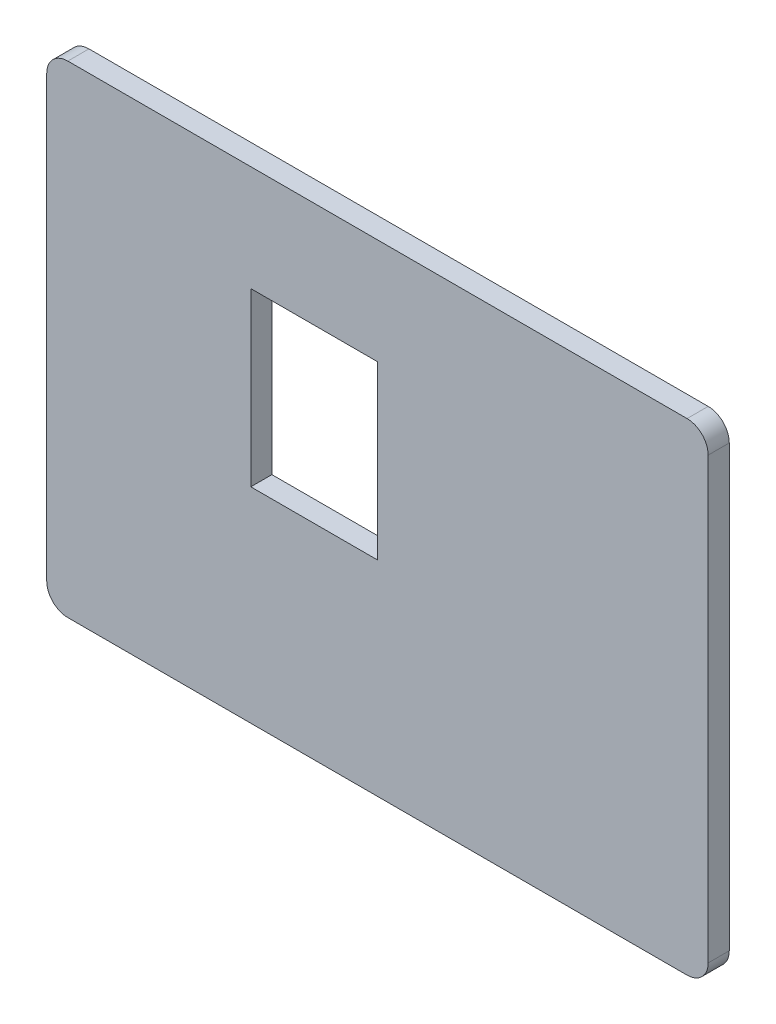
ISO-10303-21;
HEADER;
FILE_DESCRIPTION(('STEP AP214'),'2;1');
FILE_NAME('part.step','',(''),(''),'','','');
FILE_SCHEMA(('AUTOMOTIVE_DESIGN { 1 0 10303 214 1 1 1 1 }'));
ENDSEC;
DATA;
#1=APPLICATION_CONTEXT('core data for automotive mechanical design processes');
#2=APPLICATION_PROTOCOL_DEFINITION('international standard','automotive_design',2000,#1);
#3=PRODUCT_CONTEXT('',#1,'mechanical');
#4=PRODUCT('Part','Part','',(#3));
#5=PRODUCT_RELATED_PRODUCT_CATEGORY('part','',(#4));
#6=PRODUCT_DEFINITION_FORMATION('','',#4);
#7=PRODUCT_DEFINITION_CONTEXT('part definition',#1,'design');
#8=PRODUCT_DEFINITION('design','',#6,#7);
#9=PRODUCT_DEFINITION_SHAPE('','',#8);
#10=(LENGTH_UNIT() NAMED_UNIT(*) SI_UNIT(.MILLI.,.METRE.));
#11=(NAMED_UNIT(*) PLANE_ANGLE_UNIT() SI_UNIT($,.RADIAN.));
#12=(NAMED_UNIT(*) SI_UNIT($,.STERADIAN.) SOLID_ANGLE_UNIT());
#13=UNCERTAINTY_MEASURE_WITH_UNIT(LENGTH_MEASURE(1.E-05),#10,'distance_accuracy_value','');
#14=(GEOMETRIC_REPRESENTATION_CONTEXT(3) GLOBAL_UNCERTAINTY_ASSIGNED_CONTEXT((#13)) GLOBAL_UNIT_ASSIGNED_CONTEXT((#10,
#11,#12)) REPRESENTATION_CONTEXT('',''));
#15=CARTESIAN_POINT('',(0.,0.,0.));
#16=DIRECTION('',(0.,0.,1.));
#17=DIRECTION('',(1.,0.,0.));
#18=AXIS2_PLACEMENT_3D('',#15,#16,#17);
#19=CARTESIAN_POINT('',(0.,0.,1.5));
#20=DIRECTION('',(0.,0.,1.));
#21=DIRECTION('',(1.,0.,0.));
#22=AXIS2_PLACEMENT_3D('',#19,#20,#21);
#23=PLANE('',#22);
#24=DIRECTION('',(-1.,0.,0.));
#25=VECTOR('',#24,1.);
#26=CARTESIAN_POINT('',(0.,-12.8617161716172,1.5));
#27=LINE('',#26,#25);
#28=CARTESIAN_POINT('',(-1.5652390820477,-12.8617161716172,1.5));
#29=VERTEX_POINT('',#28);
#30=CARTESIAN_POINT('',(-10.5652390820477,-12.8617161716172,1.5));
#31=VERTEX_POINT('',#30);
#32=EDGE_CURVE('E216',#29,#31,#27,.T.);
#33=ORIENTED_EDGE('',*,*,#32,.T.);
#34=DIRECTION('',(0.,1.,0.));
#35=VECTOR('',#34,1.);
#36=CARTESIAN_POINT('',(-10.5652390820477,0.,1.5));
#37=LINE('',#36,#35);
#38=CARTESIAN_POINT('',(-10.5652390820477,-0.661716171617168,1.5));
#39=VERTEX_POINT('',#38);
#40=EDGE_CURVE('E219',#31,#39,#37,.T.);
#41=ORIENTED_EDGE('',*,*,#40,.T.);
#42=DIRECTION('',(1.,0.,0.));
#43=VECTOR('',#42,1.);
#44=CARTESIAN_POINT('',(0.,-0.661716171617168,1.5));
#45=LINE('',#44,#43);
#46=CARTESIAN_POINT('',(-1.5652390820477,-0.661716171617168,1.5));
#47=VERTEX_POINT('',#46);
#48=EDGE_CURVE('E210',#39,#47,#45,.T.);
#49=ORIENTED_EDGE('',*,*,#48,.T.);
#50=DIRECTION('',(0.,-1.,0.));
#51=VECTOR('',#50,1.);
#52=CARTESIAN_POINT('',(-1.5652390820477,0.,1.5));
#53=LINE('',#52,#51);
#54=EDGE_CURVE('E213',#47,#29,#53,.T.);
#55=ORIENTED_EDGE('',*,*,#54,.T.);
#56=EDGE_LOOP('',(#33,#41,#49,#55));
#57=FACE_BOUND('',#56,.T.);
#58=DIRECTION('',(1.,0.,0.));
#59=VECTOR('',#58,1.);
#60=CARTESIAN_POINT('',(-25.0652390820477,-27.4117161716172,1.5));
#61=LINE('',#60,#59);
#62=CARTESIAN_POINT('',(-23.5652390820477,-27.4117161716172,1.5));
#63=VERTEX_POINT('',#62);
#64=CARTESIAN_POINT('',(20.4347609179523,-27.4117161716172,1.5));
#65=VERTEX_POINT('',#64);
#66=EDGE_CURVE('E151',#63,#65,#61,.T.);
#67=ORIENTED_EDGE('',*,*,#66,.T.);
#68=CARTESIAN_POINT('',(20.4347609179523,-25.9117161716172,1.5));
#69=DIRECTION('',(0.,0.,1.));
#70=DIRECTION('',(1.,0.,0.));
#71=AXIS2_PLACEMENT_3D('',#68,#69,#70);
#72=CIRCLE('',#71,1.5);
#73=CARTESIAN_POINT('',(21.9347609179523,-25.9117161716172,1.5));
#74=VERTEX_POINT('',#73);
#75=EDGE_CURVE('E184',#65,#74,#72,.T.);
#76=ORIENTED_EDGE('',*,*,#75,.T.);
#77=DIRECTION('',(0.,1.,0.));
#78=VECTOR('',#77,1.);
#79=CARTESIAN_POINT('',(21.9347609179523,6.83828382838283,1.5));
#80=LINE('',#79,#78);
#81=CARTESIAN_POINT('',(21.9347609179523,5.33828382838283,1.5));
#82=VERTEX_POINT('',#81);
#83=EDGE_CURVE('E164',#74,#82,#80,.T.);
#84=ORIENTED_EDGE('',*,*,#83,.T.);
#85=CARTESIAN_POINT('',(20.4347609179523,5.33828382838283,1.5));
#86=DIRECTION('',(0.,0.,1.));
#87=DIRECTION('',(1.,0.,0.));
#88=AXIS2_PLACEMENT_3D('',#85,#86,#87);
#89=CIRCLE('',#88,1.5);
#90=CARTESIAN_POINT('',(20.4347609179523,6.83828382838283,1.5));
#91=VERTEX_POINT('',#90);
#92=EDGE_CURVE('E181',#82,#91,#89,.T.);
#93=ORIENTED_EDGE('',*,*,#92,.T.);
#94=DIRECTION('',(-1.,0.,0.));
#95=VECTOR('',#94,1.);
#96=CARTESIAN_POINT('',(-25.0652390820477,6.83828382838283,1.5));
#97=LINE('',#96,#95);
#98=CARTESIAN_POINT('',(-23.5652390820477,6.83828382838283,1.5));
#99=VERTEX_POINT('',#98);
#100=EDGE_CURVE('E132',#91,#99,#97,.T.);
#101=ORIENTED_EDGE('',*,*,#100,.T.);
#102=CARTESIAN_POINT('',(-23.5652390820477,5.33828382838283,1.5));
#103=DIRECTION('',(0.,0.,1.));
#104=DIRECTION('',(1.,0.,0.));
#105=AXIS2_PLACEMENT_3D('',#102,#103,#104);
#106=CIRCLE('',#105,1.5);
#107=CARTESIAN_POINT('',(-25.0652390820477,5.33828382838283,1.5));
#108=VERTEX_POINT('',#107);
#109=EDGE_CURVE('E126',#99,#108,#106,.T.);
#110=ORIENTED_EDGE('',*,*,#109,.T.);
#111=DIRECTION('',(0.,-1.,0.));
#112=VECTOR('',#111,1.);
#113=CARTESIAN_POINT('',(-25.0652390820477,6.83828382838283,1.5));
#114=LINE('',#113,#112);
#115=CARTESIAN_POINT('',(-25.0652390820477,-25.9117161716172,1.5));
#116=VERTEX_POINT('',#115);
#117=EDGE_CURVE('E147',#108,#116,#114,.T.);
#118=ORIENTED_EDGE('',*,*,#117,.T.);
#119=CARTESIAN_POINT('',(-23.5652390820477,-25.9117161716172,1.5));
#120=DIRECTION('',(0.,0.,1.));
#121=DIRECTION('',(1.,0.,0.));
#122=AXIS2_PLACEMENT_3D('',#119,#120,#121);
#123=CIRCLE('',#122,1.5);
#124=EDGE_CURVE('E186',#116,#63,#123,.T.);
#125=ORIENTED_EDGE('',*,*,#124,.T.);
#126=EDGE_LOOP('',(#67,#76,#84,#93,#101,#110,#118,#125));
#127=FACE_BOUND('',#126,.T.);
#128=ADVANCED_FACE('F33',(#57,#127),#23,.T.);
#129=CARTESIAN_POINT('',(0.,0.,0.));
#130=DIRECTION('',(0.,0.,1.));
#131=DIRECTION('',(1.,0.,0.));
#132=AXIS2_PLACEMENT_3D('',#129,#130,#131);
#133=PLANE('',#132);
#134=DIRECTION('',(0.,-1.,0.));
#135=VECTOR('',#134,1.);
#136=CARTESIAN_POINT('',(-10.5652390820477,-0.661716171617168,0.));
#137=LINE('',#136,#135);
#138=CARTESIAN_POINT('',(-10.5652390820477,-0.661716171617168,0.));
#139=VERTEX_POINT('',#138);
#140=CARTESIAN_POINT('',(-10.5652390820477,-12.8617161716172,0.));
#141=VERTEX_POINT('',#140);
#142=EDGE_CURVE('E189',#139,#141,#137,.T.);
#143=ORIENTED_EDGE('',*,*,#142,.T.);
#144=DIRECTION('',(1.,0.,0.));
#145=VECTOR('',#144,1.);
#146=CARTESIAN_POINT('',(-10.5652390820477,-12.8617161716172,0.));
#147=LINE('',#146,#145);
#148=CARTESIAN_POINT('',(-1.5652390820477,-12.8617161716172,0.));
#149=VERTEX_POINT('',#148);
#150=EDGE_CURVE('E192',#141,#149,#147,.T.);
#151=ORIENTED_EDGE('',*,*,#150,.T.);
#152=DIRECTION('',(0.,1.,0.));
#153=VECTOR('',#152,1.);
#154=CARTESIAN_POINT('',(-1.5652390820477,-0.661716171617168,0.));
#155=LINE('',#154,#153);
#156=CARTESIAN_POINT('',(-1.5652390820477,-0.661716171617168,0.));
#157=VERTEX_POINT('',#156);
#158=EDGE_CURVE('E195',#149,#157,#155,.T.);
#159=ORIENTED_EDGE('',*,*,#158,.T.);
#160=DIRECTION('',(-1.,0.,0.));
#161=VECTOR('',#160,1.);
#162=CARTESIAN_POINT('',(-10.5652390820477,-0.661716171617168,0.));
#163=LINE('',#162,#161);
#164=EDGE_CURVE('E198',#157,#139,#163,.T.);
#165=ORIENTED_EDGE('',*,*,#164,.T.);
#166=EDGE_LOOP('',(#143,#151,#159,#165));
#167=FACE_BOUND('',#166,.T.);
#168=CARTESIAN_POINT('',(20.4347609179523,-25.9117161716172,0.));
#169=DIRECTION('',(0.,0.,-1.));
#170=DIRECTION('',(1.,0.,0.));
#171=AXIS2_PLACEMENT_3D('',#168,#169,#170);
#172=CIRCLE('',#171,1.5);
#173=CARTESIAN_POINT('',(21.9347609179523,-25.9117161716172,0.));
#174=VERTEX_POINT('',#173);
#175=CARTESIAN_POINT('',(20.4347609179523,-27.4117161716172,0.));
#176=VERTEX_POINT('',#175);
#177=EDGE_CURVE('E55',#174,#176,#172,.T.);
#178=ORIENTED_EDGE('',*,*,#177,.T.);
#179=DIRECTION('',(1.,0.,0.));
#180=VECTOR('',#179,1.);
#181=CARTESIAN_POINT('',(-25.0652390820477,-27.4117161716172,0.));
#182=LINE('',#181,#180);
#183=CARTESIAN_POINT('',(-23.5652390820477,-27.4117161716172,0.));
#184=VERTEX_POINT('',#183);
#185=EDGE_CURVE('E154',#184,#176,#182,.T.);
#186=ORIENTED_EDGE('',*,*,#185,.F.);
#187=CARTESIAN_POINT('',(-23.5652390820477,-25.9117161716172,0.));
#188=DIRECTION('',(0.,0.,-1.));
#189=DIRECTION('',(1.,0.,0.));
#190=AXIS2_PLACEMENT_3D('',#187,#188,#189);
#191=CIRCLE('',#190,1.5);
#192=CARTESIAN_POINT('',(-25.0652390820477,-25.9117161716172,0.));
#193=VERTEX_POINT('',#192);
#194=EDGE_CURVE('E48',#184,#193,#191,.T.);
#195=ORIENTED_EDGE('',*,*,#194,.T.);
#196=DIRECTION('',(0.,-1.,0.));
#197=VECTOR('',#196,1.);
#198=CARTESIAN_POINT('',(-25.0652390820477,6.83828382838283,0.));
#199=LINE('',#198,#197);
#200=CARTESIAN_POINT('',(-25.0652390820477,5.33828382838283,0.));
#201=VERTEX_POINT('',#200);
#202=EDGE_CURVE('E141',#201,#193,#199,.T.);
#203=ORIENTED_EDGE('',*,*,#202,.F.);
#204=CARTESIAN_POINT('',(-23.5652390820477,5.33828382838283,0.));
#205=DIRECTION('',(0.,0.,-1.));
#206=DIRECTION('',(1.,0.,0.));
#207=AXIS2_PLACEMENT_3D('',#204,#205,#206);
#208=CIRCLE('',#207,1.5);
#209=CARTESIAN_POINT('',(-23.5652390820477,6.83828382838283,0.));
#210=VERTEX_POINT('',#209);
#211=EDGE_CURVE('E123',#201,#210,#208,.T.);
#212=ORIENTED_EDGE('',*,*,#211,.T.);
#213=DIRECTION('',(-1.,0.,0.));
#214=VECTOR('',#213,1.);
#215=CARTESIAN_POINT('',(-25.0652390820477,6.83828382838283,0.));
#216=LINE('',#215,#214);
#217=CARTESIAN_POINT('',(20.4347609179523,6.83828382838283,0.));
#218=VERTEX_POINT('',#217);
#219=EDGE_CURVE('E139',#218,#210,#216,.T.);
#220=ORIENTED_EDGE('',*,*,#219,.F.);
#221=CARTESIAN_POINT('',(20.4347609179523,5.33828382838283,0.));
#222=DIRECTION('',(0.,0.,-1.));
#223=DIRECTION('',(1.,0.,0.));
#224=AXIS2_PLACEMENT_3D('',#221,#222,#223);
#225=CIRCLE('',#224,1.5);
#226=CARTESIAN_POINT('',(21.9347609179523,5.33828382838283,0.));
#227=VERTEX_POINT('',#226);
#228=EDGE_CURVE('E168',#218,#227,#225,.T.);
#229=ORIENTED_EDGE('',*,*,#228,.T.);
#230=DIRECTION('',(0.,1.,0.));
#231=VECTOR('',#230,1.);
#232=CARTESIAN_POINT('',(21.9347609179523,6.83828382838283,0.));
#233=LINE('',#232,#231);
#234=EDGE_CURVE('E148',#174,#227,#233,.T.);
#235=ORIENTED_EDGE('',*,*,#234,.F.);
#236=EDGE_LOOP('',(#178,#186,#195,#203,#212,#220,#229,#235));
#237=FACE_BOUND('',#236,.T.);
#238=ADVANCED_FACE('F137',(#167,#237),#133,.F.);
#239=CARTESIAN_POINT('',(-25.0652390820477,6.83828382838283,1.5));
#240=DIRECTION('',(1.,0.,0.));
#241=DIRECTION('',(0.,1.,0.));
#242=AXIS2_PLACEMENT_3D('',#239,#240,#241);
#243=PLANE('',#242);
#244=ORIENTED_EDGE('',*,*,#117,.F.);
#245=DIRECTION('',(0.,0.,-1.));
#246=VECTOR('',#245,1.);
#247=CARTESIAN_POINT('',(-25.0652390820477,5.33828382838283,21.5));
#248=LINE('',#247,#246);
#249=EDGE_CURVE('E142',#108,#201,#248,.T.);
#250=ORIENTED_EDGE('',*,*,#249,.T.);
#251=ORIENTED_EDGE('',*,*,#202,.T.);
#252=DIRECTION('',(0.,0.,-1.));
#253=VECTOR('',#252,1.);
#254=CARTESIAN_POINT('',(-25.0652390820477,-25.9117161716172,21.5));
#255=LINE('',#254,#253);
#256=EDGE_CURVE('E178',#116,#193,#255,.T.);
#257=ORIENTED_EDGE('',*,*,#256,.F.);
#258=EDGE_LOOP('',(#244,#250,#251,#257));
#259=FACE_BOUND('',#258,.T.);
#260=ADVANCED_FACE('F35',(#259),#243,.F.);
#261=CARTESIAN_POINT('',(-25.0652390820477,-27.4117161716172,1.5));
#262=DIRECTION('',(0.,1.,0.));
#263=DIRECTION('',(0.,0.,1.));
#264=AXIS2_PLACEMENT_3D('',#261,#262,#263);
#265=PLANE('',#264);
#266=DIRECTION('',(0.,0.,-1.));
#267=VECTOR('',#266,1.);
#268=CARTESIAN_POINT('',(20.4347609179523,-27.4117161716172,21.5));
#269=LINE('',#268,#267);
#270=EDGE_CURVE('E170',#65,#176,#269,.T.);
#271=ORIENTED_EDGE('',*,*,#270,.F.);
#272=ORIENTED_EDGE('',*,*,#66,.F.);
#273=DIRECTION('',(0.,0.,-1.));
#274=VECTOR('',#273,1.);
#275=CARTESIAN_POINT('',(-23.5652390820477,-27.4117161716172,21.5));
#276=LINE('',#275,#274);
#277=EDGE_CURVE('E11',#63,#184,#276,.T.);
#278=ORIENTED_EDGE('',*,*,#277,.T.);
#279=ORIENTED_EDGE('',*,*,#185,.T.);
#280=EDGE_LOOP('',(#271,#272,#278,#279));
#281=FACE_BOUND('',#280,.T.);
#282=ADVANCED_FACE('F228',(#281),#265,.F.);
#283=CARTESIAN_POINT('',(21.9347609179523,6.83828382838283,1.5));
#284=DIRECTION('',(-1.,0.,0.));
#285=DIRECTION('',(0.,-1.,0.));
#286=AXIS2_PLACEMENT_3D('',#283,#284,#285);
#287=PLANE('',#286);
#288=ORIENTED_EDGE('',*,*,#83,.F.);
#289=DIRECTION('',(0.,0.,-1.));
#290=VECTOR('',#289,1.);
#291=CARTESIAN_POINT('',(21.9347609179523,-25.9117161716172,21.5));
#292=LINE('',#291,#290);
#293=EDGE_CURVE('E41',#74,#174,#292,.T.);
#294=ORIENTED_EDGE('',*,*,#293,.T.);
#295=ORIENTED_EDGE('',*,*,#234,.T.);
#296=DIRECTION('',(0.,0.,-1.));
#297=VECTOR('',#296,1.);
#298=CARTESIAN_POINT('',(21.9347609179523,5.33828382838283,21.5));
#299=LINE('',#298,#297);
#300=EDGE_CURVE('E143',#82,#227,#299,.T.);
#301=ORIENTED_EDGE('',*,*,#300,.F.);
#302=EDGE_LOOP('',(#288,#294,#295,#301));
#303=FACE_BOUND('',#302,.T.);
#304=ADVANCED_FACE('F161',(#303),#287,.F.);
#305=CARTESIAN_POINT('',(-25.0652390820477,6.83828382838283,1.5));
#306=DIRECTION('',(0.,-1.,0.));
#307=DIRECTION('',(0.,0.,-1.));
#308=AXIS2_PLACEMENT_3D('',#305,#306,#307);
#309=PLANE('',#308);
#310=ORIENTED_EDGE('',*,*,#100,.F.);
#311=DIRECTION('',(0.,0.,-1.));
#312=VECTOR('',#311,1.);
#313=CARTESIAN_POINT('',(20.4347609179523,6.83828382838283,21.5));
#314=LINE('',#313,#312);
#315=EDGE_CURVE('E131',#91,#218,#314,.T.);
#316=ORIENTED_EDGE('',*,*,#315,.T.);
#317=ORIENTED_EDGE('',*,*,#219,.T.);
#318=DIRECTION('',(0.,0.,-1.));
#319=VECTOR('',#318,1.);
#320=CARTESIAN_POINT('',(-23.5652390820477,6.83828382838283,21.5));
#321=LINE('',#320,#319);
#322=EDGE_CURVE('E120',#99,#210,#321,.T.);
#323=ORIENTED_EDGE('',*,*,#322,.F.);
#324=EDGE_LOOP('',(#310,#316,#317,#323));
#325=FACE_BOUND('',#324,.T.);
#326=ADVANCED_FACE('F146',(#325),#309,.F.);
#327=CARTESIAN_POINT('',(-10.5652390820477,-0.661716171617168,21.5));
#328=DIRECTION('',(1.,0.,0.));
#329=DIRECTION('',(0.,1.,0.));
#330=AXIS2_PLACEMENT_3D('',#327,#328,#329);
#331=PLANE('',#330);
#332=DIRECTION('',(0.,0.,-1.));
#333=VECTOR('',#332,1.);
#334=CARTESIAN_POINT('',(-10.5652390820477,-12.8617161716172,21.5));
#335=LINE('',#334,#333);
#336=EDGE_CURVE('E208',#31,#141,#335,.T.);
#337=ORIENTED_EDGE('',*,*,#336,.T.);
#338=ORIENTED_EDGE('',*,*,#142,.F.);
#339=DIRECTION('',(0.,0.,-1.));
#340=VECTOR('',#339,1.);
#341=CARTESIAN_POINT('',(-10.5652390820477,-0.661716171617168,21.5));
#342=LINE('',#341,#340);
#343=EDGE_CURVE('E201',#39,#139,#342,.T.);
#344=ORIENTED_EDGE('',*,*,#343,.F.);
#345=ORIENTED_EDGE('',*,*,#40,.F.);
#346=EDGE_LOOP('',(#337,#338,#344,#345));
#347=FACE_BOUND('',#346,.T.);
#348=ADVANCED_FACE('F255',(#347),#331,.T.);
#349=CARTESIAN_POINT('',(-10.5652390820477,-12.8617161716172,21.5));
#350=DIRECTION('',(0.,1.,0.));
#351=DIRECTION('',(0.,0.,1.));
#352=AXIS2_PLACEMENT_3D('',#349,#350,#351);
#353=PLANE('',#352);
#354=DIRECTION('',(0.,0.,-1.));
#355=VECTOR('',#354,1.);
#356=CARTESIAN_POINT('',(-1.5652390820477,-12.8617161716172,21.5));
#357=LINE('',#356,#355);
#358=EDGE_CURVE('E206',#29,#149,#357,.T.);
#359=ORIENTED_EDGE('',*,*,#358,.T.);
#360=ORIENTED_EDGE('',*,*,#150,.F.);
#361=ORIENTED_EDGE('',*,*,#336,.F.);
#362=ORIENTED_EDGE('',*,*,#32,.F.);
#363=EDGE_LOOP('',(#359,#360,#361,#362));
#364=FACE_BOUND('',#363,.T.);
#365=ADVANCED_FACE('F296',(#364),#353,.T.);
#366=CARTESIAN_POINT('',(-1.5652390820477,-0.661716171617168,21.5));
#367=DIRECTION('',(-1.,0.,0.));
#368=DIRECTION('',(0.,-1.,0.));
#369=AXIS2_PLACEMENT_3D('',#366,#367,#368);
#370=PLANE('',#369);
#371=DIRECTION('',(0.,0.,-1.));
#372=VECTOR('',#371,1.);
#373=CARTESIAN_POINT('',(-1.5652390820477,-0.661716171617168,21.5));
#374=LINE('',#373,#372);
#375=EDGE_CURVE('E204',#47,#157,#374,.T.);
#376=ORIENTED_EDGE('',*,*,#375,.T.);
#377=ORIENTED_EDGE('',*,*,#158,.F.);
#378=ORIENTED_EDGE('',*,*,#358,.F.);
#379=ORIENTED_EDGE('',*,*,#54,.F.);
#380=EDGE_LOOP('',(#376,#377,#378,#379));
#381=FACE_BOUND('',#380,.T.);
#382=ADVANCED_FACE('F285',(#381),#370,.T.);
#383=CARTESIAN_POINT('',(-10.5652390820477,-0.661716171617168,21.5));
#384=DIRECTION('',(0.,-1.,0.));
#385=DIRECTION('',(0.,0.,-1.));
#386=AXIS2_PLACEMENT_3D('',#383,#384,#385);
#387=PLANE('',#386);
#388=ORIENTED_EDGE('',*,*,#343,.T.);
#389=ORIENTED_EDGE('',*,*,#164,.F.);
#390=ORIENTED_EDGE('',*,*,#375,.F.);
#391=ORIENTED_EDGE('',*,*,#48,.F.);
#392=EDGE_LOOP('',(#388,#389,#390,#391));
#393=FACE_BOUND('',#392,.T.);
#394=ADVANCED_FACE('F244',(#393),#387,.T.);
#395=CARTESIAN_POINT('',(-23.5652390820477,5.33828382838283,21.5));
#396=DIRECTION('',(0.,0.,-1.));
#397=DIRECTION('',(-1.,0.,0.));
#398=AXIS2_PLACEMENT_3D('',#395,#396,#397);
#399=CYLINDRICAL_SURFACE('',#398,1.5);
#400=ORIENTED_EDGE('',*,*,#322,.T.);
#401=ORIENTED_EDGE('',*,*,#211,.F.);
#402=ORIENTED_EDGE('',*,*,#249,.F.);
#403=ORIENTED_EDGE('',*,*,#109,.F.);
#404=EDGE_LOOP('',(#400,#401,#402,#403));
#405=FACE_BOUND('',#404,.T.);
#406=ADVANCED_FACE('F122',(#405),#399,.T.);
#407=CARTESIAN_POINT('',(20.4347609179523,5.33828382838283,21.5));
#408=DIRECTION('',(0.,0.,-1.));
#409=DIRECTION('',(-1.,0.,0.));
#410=AXIS2_PLACEMENT_3D('',#407,#408,#409);
#411=CYLINDRICAL_SURFACE('',#410,1.5);
#412=ORIENTED_EDGE('',*,*,#300,.T.);
#413=ORIENTED_EDGE('',*,*,#228,.F.);
#414=ORIENTED_EDGE('',*,*,#315,.F.);
#415=ORIENTED_EDGE('',*,*,#92,.F.);
#416=EDGE_LOOP('',(#412,#413,#414,#415));
#417=FACE_BOUND('',#416,.T.);
#418=ADVANCED_FACE('F234',(#417),#411,.T.);
#419=CARTESIAN_POINT('',(20.4347609179523,-25.9117161716172,21.5));
#420=DIRECTION('',(0.,0.,-1.));
#421=DIRECTION('',(-1.,0.,0.));
#422=AXIS2_PLACEMENT_3D('',#419,#420,#421);
#423=CYLINDRICAL_SURFACE('',#422,1.5);
#424=ORIENTED_EDGE('',*,*,#270,.T.);
#425=ORIENTED_EDGE('',*,*,#177,.F.);
#426=ORIENTED_EDGE('',*,*,#293,.F.);
#427=ORIENTED_EDGE('',*,*,#75,.F.);
#428=EDGE_LOOP('',(#424,#425,#426,#427));
#429=FACE_BOUND('',#428,.T.);
#430=ADVANCED_FACE('F236',(#429),#423,.T.);
#431=CARTESIAN_POINT('',(-23.5652390820477,-25.9117161716172,21.5));
#432=DIRECTION('',(0.,0.,-1.));
#433=DIRECTION('',(-1.,0.,0.));
#434=AXIS2_PLACEMENT_3D('',#431,#432,#433);
#435=CYLINDRICAL_SURFACE('',#434,1.5);
#436=ORIENTED_EDGE('',*,*,#256,.T.);
#437=ORIENTED_EDGE('',*,*,#194,.F.);
#438=ORIENTED_EDGE('',*,*,#277,.F.);
#439=ORIENTED_EDGE('',*,*,#124,.F.);
#440=EDGE_LOOP('',(#436,#437,#438,#439));
#441=FACE_BOUND('',#440,.T.);
#442=ADVANCED_FACE('F242',(#441),#435,.T.);
#443=CLOSED_SHELL('',(#128,#238,#260,#282,#304,#326,#348,#365,#382,#394,#406,#418,#430,#442));
#444=MANIFOLD_SOLID_BREP('B2',#443);
#445=ADVANCED_BREP_SHAPE_REPRESENTATION('',(#18,#444),#14);
#446=SHAPE_DEFINITION_REPRESENTATION(#9,#445);
ENDSEC;
END-ISO-10303-21;
